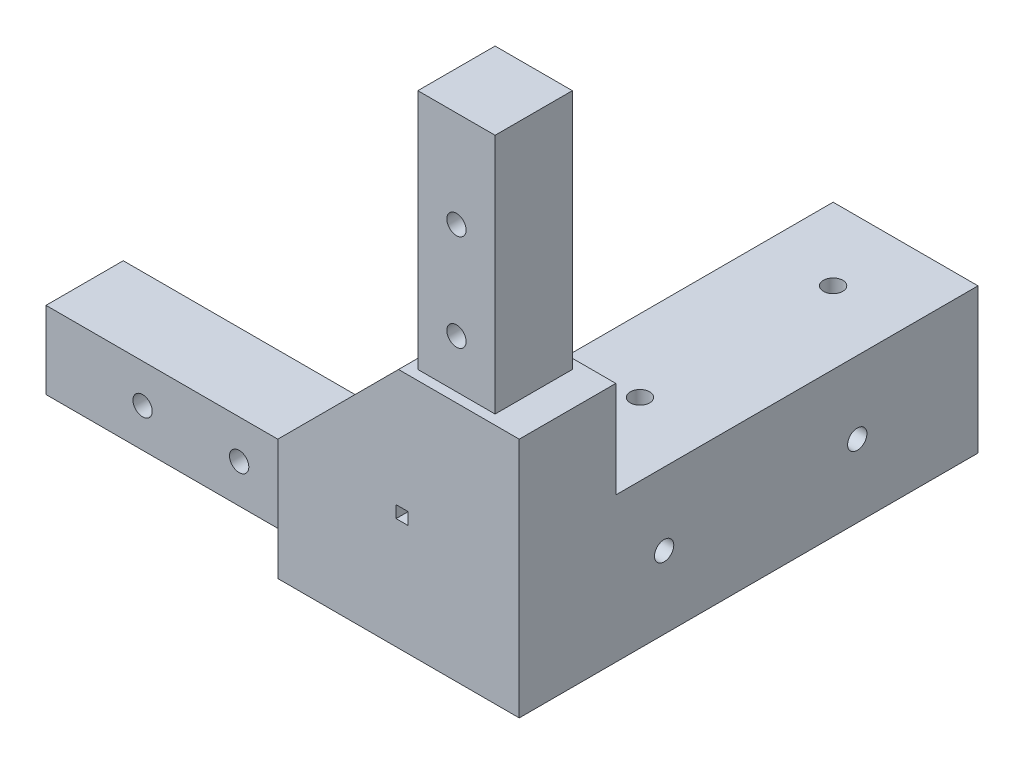
ISO-10303-21;
HEADER;
FILE_DESCRIPTION(('STEP AP214'),'2;1');
FILE_NAME('part.step','',(''),(''),'','','');
FILE_SCHEMA(('AUTOMOTIVE_DESIGN { 1 0 10303 214 1 1 1 1 }'));
ENDSEC;
DATA;
#1=APPLICATION_CONTEXT('core data for automotive mechanical design processes');
#2=APPLICATION_PROTOCOL_DEFINITION('international standard','automotive_design',2000,#1);
#3=PRODUCT_CONTEXT('',#1,'mechanical');
#4=PRODUCT('Part','Part','',(#3));
#5=PRODUCT_RELATED_PRODUCT_CATEGORY('part','',(#4));
#6=PRODUCT_DEFINITION_FORMATION('','',#4);
#7=PRODUCT_DEFINITION_CONTEXT('part definition',#1,'design');
#8=PRODUCT_DEFINITION('design','',#6,#7);
#9=PRODUCT_DEFINITION_SHAPE('','',#8);
#10=(LENGTH_UNIT() NAMED_UNIT(*) SI_UNIT(.MILLI.,.METRE.));
#11=(NAMED_UNIT(*) PLANE_ANGLE_UNIT() SI_UNIT($,.RADIAN.));
#12=(NAMED_UNIT(*) SI_UNIT($,.STERADIAN.) SOLID_ANGLE_UNIT());
#13=UNCERTAINTY_MEASURE_WITH_UNIT(LENGTH_MEASURE(1.E-05),#10,'distance_accuracy_value','');
#14=(GEOMETRIC_REPRESENTATION_CONTEXT(3) GLOBAL_UNCERTAINTY_ASSIGNED_CONTEXT((#13)) GLOBAL_UNIT_ASSIGNED_CONTEXT((#10,
#11,#12)) REPRESENTATION_CONTEXT('',''));
#15=CARTESIAN_POINT('',(0.,0.,0.));
#16=DIRECTION('',(0.,0.,1.));
#17=DIRECTION('',(1.,0.,0.));
#18=AXIS2_PLACEMENT_3D('',#15,#16,#17);
#19=CARTESIAN_POINT('',(50.,-50.,-100.));
#20=DIRECTION('',(1.,0.,0.));
#21=DIRECTION('',(0.,0.,-1.));
#22=AXIS2_PLACEMENT_3D('',#19,#20,#21);
#23=PLANE('',#22);
#24=DIRECTION('',(0.,0.,-1.));
#25=VECTOR('',#24,1.);
#26=CARTESIAN_POINT('',(50.,-20.,-30.));
#27=LINE('',#26,#25);
#28=CARTESIAN_POINT('',(50.,-20.,-25.));
#29=VERTEX_POINT('',#28);
#30=CARTESIAN_POINT('',(50.,-20.,-100.));
#31=VERTEX_POINT('',#30);
#32=EDGE_CURVE('E430',#29,#31,#27,.T.);
#33=ORIENTED_EDGE('',*,*,#32,.F.);
#34=DIRECTION('',(0.,1.,0.));
#35=VECTOR('',#34,1.);
#36=CARTESIAN_POINT('',(50.,-24.,-25.));
#37=LINE('',#36,#35);
#38=CARTESIAN_POINT('',(50.,0.,-25.));
#39=VERTEX_POINT('',#38);
#40=EDGE_CURVE('E218',#29,#39,#37,.T.);
#41=ORIENTED_EDGE('',*,*,#40,.T.);
#42=DIRECTION('',(0.,0.,-1.));
#43=VECTOR('',#42,1.);
#44=CARTESIAN_POINT('',(50.,0.,-5.));
#45=LINE('',#44,#43);
#46=CARTESIAN_POINT('',(50.,0.,-5.));
#47=VERTEX_POINT('',#46);
#48=EDGE_CURVE('E209',#47,#39,#45,.T.);
#49=ORIENTED_EDGE('',*,*,#48,.F.);
#50=DIRECTION('',(0.,1.,0.));
#51=VECTOR('',#50,1.);
#52=CARTESIAN_POINT('',(50.,-50.,-5.));
#53=LINE('',#52,#51);
#54=CARTESIAN_POINT('',(50.,-50.,-5.));
#55=VERTEX_POINT('',#54);
#56=EDGE_CURVE('E192',#55,#47,#53,.T.);
#57=ORIENTED_EDGE('',*,*,#56,.F.);
#58=DIRECTION('',(0.,0.,1.));
#59=VECTOR('',#58,1.);
#60=CARTESIAN_POINT('',(50.,-50.,-100.));
#61=LINE('',#60,#59);
#62=CARTESIAN_POINT('',(50.,-50.,-100.));
#63=VERTEX_POINT('',#62);
#64=EDGE_CURVE('E11',#63,#55,#61,.T.);
#65=ORIENTED_EDGE('',*,*,#64,.F.);
#66=DIRECTION('',(0.,1.,0.));
#67=VECTOR('',#66,1.);
#68=CARTESIAN_POINT('',(50.,-50.,-100.));
#69=LINE('',#68,#67);
#70=EDGE_CURVE('E42',#63,#31,#69,.T.);
#71=ORIENTED_EDGE('',*,*,#70,.T.);
#72=EDGE_LOOP('',(#33,#41,#49,#57,#65,#71));
#73=FACE_BOUND('',#72,.T.);
#74=CARTESIAN_POINT('',(50.,-35.,-35.));
#75=DIRECTION('',(1.,0.,0.));
#76=DIRECTION('',(0.,0.,-1.));
#77=AXIS2_PLACEMENT_3D('',#74,#75,#76);
#78=CIRCLE('',#77,2.);
#79=CARTESIAN_POINT('',(50.,-35.,-37.));
#80=VERTEX_POINT('',#79);
#81=EDGE_CURVE('E278',#80,#80,#78,.T.);
#82=ORIENTED_EDGE('',*,*,#81,.F.);
#83=EDGE_LOOP('',(#82));
#84=FACE_BOUND('',#83,.T.);
#85=CARTESIAN_POINT('',(50.,-35.,-75.));
#86=DIRECTION('',(1.,0.,0.));
#87=DIRECTION('',(0.,0.,-1.));
#88=AXIS2_PLACEMENT_3D('',#85,#86,#87);
#89=CIRCLE('',#88,2.);
#90=CARTESIAN_POINT('',(50.,-35.,-77.));
#91=VERTEX_POINT('',#90);
#92=EDGE_CURVE('E289',#91,#91,#89,.T.);
#93=ORIENTED_EDGE('',*,*,#92,.F.);
#94=EDGE_LOOP('',(#93));
#95=FACE_BOUND('',#94,.T.);
#96=ADVANCED_FACE('F33',(#73,#84,#95),#23,.T.);
#97=CARTESIAN_POINT('',(20.,-50.,-30.));
#98=DIRECTION('',(1.,0.,0.));
#99=DIRECTION('',(0.,0.,-1.));
#100=AXIS2_PLACEMENT_3D('',#97,#98,#99);
#101=PLANE('',#100);
#102=CARTESIAN_POINT('',(20.,-35.,-75.));
#103=DIRECTION('',(1.,0.,0.));
#104=DIRECTION('',(0.,0.,-1.));
#105=AXIS2_PLACEMENT_3D('',#102,#103,#104);
#106=CIRCLE('',#105,2.);
#107=CARTESIAN_POINT('',(20.,-35.,-77.));
#108=VERTEX_POINT('',#107);
#109=EDGE_CURVE('E290',#108,#108,#106,.T.);
#110=ORIENTED_EDGE('',*,*,#109,.T.);
#111=EDGE_LOOP('',(#110));
#112=FACE_BOUND('',#111,.T.);
#113=CARTESIAN_POINT('',(20.,-35.,-35.));
#114=DIRECTION('',(1.,0.,0.));
#115=DIRECTION('',(0.,0.,-1.));
#116=AXIS2_PLACEMENT_3D('',#113,#114,#115);
#117=CIRCLE('',#116,2.);
#118=CARTESIAN_POINT('',(20.,-35.,-37.));
#119=VERTEX_POINT('',#118);
#120=EDGE_CURVE('E281',#119,#119,#117,.T.);
#121=ORIENTED_EDGE('',*,*,#120,.T.);
#122=EDGE_LOOP('',(#121));
#123=FACE_BOUND('',#122,.T.);
#124=DIRECTION('',(0.,0.,-1.));
#125=VECTOR('',#124,1.);
#126=CARTESIAN_POINT('',(20.,-50.,-30.));
#127=LINE('',#126,#125);
#128=CARTESIAN_POINT('',(20.,-50.,-25.));
#129=VERTEX_POINT('',#128);
#130=CARTESIAN_POINT('',(20.,-50.,-100.));
#131=VERTEX_POINT('',#130);
#132=EDGE_CURVE('E431',#129,#131,#127,.T.);
#133=ORIENTED_EDGE('',*,*,#132,.F.);
#134=DIRECTION('',(0.,-1.,0.));
#135=VECTOR('',#134,1.);
#136=CARTESIAN_POINT('',(20.,-25.,-25.));
#137=LINE('',#136,#135);
#138=CARTESIAN_POINT('',(20.,-20.,-25.));
#139=VERTEX_POINT('',#138);
#140=EDGE_CURVE('E354',#139,#129,#137,.T.);
#141=ORIENTED_EDGE('',*,*,#140,.F.);
#142=DIRECTION('',(0.,0.,-1.));
#143=VECTOR('',#142,1.);
#144=CARTESIAN_POINT('',(20.,-20.,-30.));
#145=LINE('',#144,#143);
#146=CARTESIAN_POINT('',(20.,-20.,-100.));
#147=VERTEX_POINT('',#146);
#148=EDGE_CURVE('E434',#139,#147,#145,.T.);
#149=ORIENTED_EDGE('',*,*,#148,.T.);
#150=DIRECTION('',(0.,-1.,0.));
#151=VECTOR('',#150,1.);
#152=CARTESIAN_POINT('',(20.,-50.,-100.));
#153=LINE('',#152,#151);
#154=EDGE_CURVE('E427',#147,#131,#153,.T.);
#155=ORIENTED_EDGE('',*,*,#154,.T.);
#156=EDGE_LOOP('',(#133,#141,#149,#155));
#157=FACE_BOUND('',#156,.T.);
#158=ADVANCED_FACE('F466',(#112,#123,#157),#101,.F.);
#159=CARTESIAN_POINT('',(50.,-50.,-100.));
#160=DIRECTION('',(0.,-1.,0.));
#161=DIRECTION('',(1.,0.,0.));
#162=AXIS2_PLACEMENT_3D('',#159,#160,#161);
#163=PLANE('',#162);
#164=DIRECTION('',(1.,0.,0.));
#165=VECTOR('',#164,1.);
#166=CARTESIAN_POINT('',(20.,-50.,-5.));
#167=LINE('',#166,#165);
#168=CARTESIAN_POINT('',(0.,-50.,-4.99999999999999));
#169=VERTEX_POINT('',#168);
#170=EDGE_CURVE('E199',#169,#55,#167,.T.);
#171=ORIENTED_EDGE('',*,*,#170,.F.);
#172=DIRECTION('',(0.,0.,1.));
#173=VECTOR('',#172,1.);
#174=CARTESIAN_POINT('',(0.,-50.,-4.99999999999999));
#175=LINE('',#174,#173);
#176=CARTESIAN_POINT('',(0.,-50.,-25.));
#177=VERTEX_POINT('',#176);
#178=EDGE_CURVE('E238',#177,#169,#175,.T.);
#179=ORIENTED_EDGE('',*,*,#178,.F.);
#180=DIRECTION('',(-1.,0.,0.));
#181=VECTOR('',#180,1.);
#182=CARTESIAN_POINT('',(24.,-50.,-25.));
#183=LINE('',#182,#181);
#184=EDGE_CURVE('E245',#129,#177,#183,.T.);
#185=ORIENTED_EDGE('',*,*,#184,.F.);
#186=ORIENTED_EDGE('',*,*,#132,.T.);
#187=DIRECTION('',(1.,0.,0.));
#188=VECTOR('',#187,1.);
#189=CARTESIAN_POINT('',(50.,-50.,-100.));
#190=LINE('',#189,#188);
#191=EDGE_CURVE('E433',#131,#63,#190,.T.);
#192=ORIENTED_EDGE('',*,*,#191,.T.);
#193=ORIENTED_EDGE('',*,*,#64,.T.);
#194=EDGE_LOOP('',(#171,#179,#185,#186,#192,#193));
#195=FACE_BOUND('',#194,.T.);
#196=CARTESIAN_POINT('',(35.,-50.,-45.));
#197=DIRECTION('',(0.,1.,0.));
#198=DIRECTION('',(0.,0.,1.));
#199=AXIS2_PLACEMENT_3D('',#196,#197,#198);
#200=CIRCLE('',#199,2.);
#201=CARTESIAN_POINT('',(35.,-50.,-43.));
#202=VERTEX_POINT('',#201);
#203=EDGE_CURVE('E300',#202,#202,#200,.T.);
#204=ORIENTED_EDGE('',*,*,#203,.T.);
#205=EDGE_LOOP('',(#204));
#206=FACE_BOUND('',#205,.T.);
#207=CARTESIAN_POINT('',(35.,-50.,-85.));
#208=DIRECTION('',(0.,1.,0.));
#209=DIRECTION('',(0.,0.,1.));
#210=AXIS2_PLACEMENT_3D('',#207,#208,#209);
#211=CIRCLE('',#210,2.);
#212=CARTESIAN_POINT('',(35.,-50.,-83.));
#213=VERTEX_POINT('',#212);
#214=EDGE_CURVE('E310',#213,#213,#211,.T.);
#215=ORIENTED_EDGE('',*,*,#214,.T.);
#216=EDGE_LOOP('',(#215));
#217=FACE_BOUND('',#216,.T.);
#218=ADVANCED_FACE('F471',(#195,#206,#217),#163,.T.);
#219=CARTESIAN_POINT('',(20.,-20.,-30.));
#220=DIRECTION('',(0.,-1.,0.));
#221=DIRECTION('',(0.,0.,-1.));
#222=AXIS2_PLACEMENT_3D('',#219,#220,#221);
#223=PLANE('',#222);
#224=CARTESIAN_POINT('',(35.,-20.,-85.));
#225=DIRECTION('',(0.,1.,0.));
#226=DIRECTION('',(0.,0.,1.));
#227=AXIS2_PLACEMENT_3D('',#224,#225,#226);
#228=CIRCLE('',#227,2.);
#229=CARTESIAN_POINT('',(35.,-20.,-83.));
#230=VERTEX_POINT('',#229);
#231=EDGE_CURVE('E309',#230,#230,#228,.T.);
#232=ORIENTED_EDGE('',*,*,#231,.F.);
#233=EDGE_LOOP('',(#232));
#234=FACE_BOUND('',#233,.T.);
#235=CARTESIAN_POINT('',(35.,-20.,-45.));
#236=DIRECTION('',(0.,1.,0.));
#237=DIRECTION('',(0.,0.,1.));
#238=AXIS2_PLACEMENT_3D('',#235,#236,#237);
#239=CIRCLE('',#238,2.);
#240=CARTESIAN_POINT('',(35.,-20.,-43.));
#241=VERTEX_POINT('',#240);
#242=EDGE_CURVE('E299',#241,#241,#239,.T.);
#243=ORIENTED_EDGE('',*,*,#242,.F.);
#244=EDGE_LOOP('',(#243));
#245=FACE_BOUND('',#244,.T.);
#246=DIRECTION('',(-1.,0.,0.));
#247=VECTOR('',#246,1.);
#248=CARTESIAN_POINT('',(25.,-20.,-25.));
#249=LINE('',#248,#247);
#250=EDGE_CURVE('E351',#29,#139,#249,.T.);
#251=ORIENTED_EDGE('',*,*,#250,.F.);
#252=ORIENTED_EDGE('',*,*,#32,.T.);
#253=DIRECTION('',(-1.,0.,0.));
#254=VECTOR('',#253,1.);
#255=CARTESIAN_POINT('',(20.,-20.,-100.));
#256=LINE('',#255,#254);
#257=EDGE_CURVE('E419',#31,#147,#256,.T.);
#258=ORIENTED_EDGE('',*,*,#257,.T.);
#259=ORIENTED_EDGE('',*,*,#148,.F.);
#260=EDGE_LOOP('',(#251,#252,#258,#259));
#261=FACE_BOUND('',#260,.T.);
#262=ADVANCED_FACE('F478',(#234,#245,#261),#223,.F.);
#263=CARTESIAN_POINT('',(0.,0.,-100.));
#264=DIRECTION('',(0.,0.,1.));
#265=DIRECTION('',(1.,0.,0.));
#266=AXIS2_PLACEMENT_3D('',#263,#264,#265);
#267=PLANE('',#266);
#268=DIRECTION('',(-1.,0.,0.));
#269=VECTOR('',#268,1.);
#270=CARTESIAN_POINT('',(24.5,-45.5,-100.));
#271=LINE('',#270,#269);
#272=CARTESIAN_POINT('',(45.5,-45.5,-100.));
#273=VERTEX_POINT('',#272);
#274=CARTESIAN_POINT('',(24.5,-45.5,-100.));
#275=VERTEX_POINT('',#274);
#276=EDGE_CURVE('E410',#273,#275,#271,.T.);
#277=ORIENTED_EDGE('',*,*,#276,.F.);
#278=DIRECTION('',(0.,-1.,0.));
#279=VECTOR('',#278,1.);
#280=CARTESIAN_POINT('',(45.5,-45.5,-100.));
#281=LINE('',#280,#279);
#282=CARTESIAN_POINT('',(45.5,-24.5,-100.));
#283=VERTEX_POINT('',#282);
#284=EDGE_CURVE('E389',#283,#273,#281,.T.);
#285=ORIENTED_EDGE('',*,*,#284,.F.);
#286=DIRECTION('',(1.,0.,0.));
#287=VECTOR('',#286,1.);
#288=CARTESIAN_POINT('',(24.5,-24.5,-100.));
#289=LINE('',#288,#287);
#290=CARTESIAN_POINT('',(24.5,-24.5,-100.));
#291=VERTEX_POINT('',#290);
#292=EDGE_CURVE('E400',#291,#283,#289,.T.);
#293=ORIENTED_EDGE('',*,*,#292,.F.);
#294=DIRECTION('',(0.,1.,0.));
#295=VECTOR('',#294,1.);
#296=CARTESIAN_POINT('',(24.5,-45.5,-100.));
#297=LINE('',#296,#295);
#298=EDGE_CURVE('E413',#275,#291,#297,.T.);
#299=ORIENTED_EDGE('',*,*,#298,.F.);
#300=EDGE_LOOP('',(#277,#285,#293,#299));
#301=FACE_BOUND('',#300,.T.);
#302=ORIENTED_EDGE('',*,*,#191,.F.);
#303=ORIENTED_EDGE('',*,*,#154,.F.);
#304=ORIENTED_EDGE('',*,*,#257,.F.);
#305=ORIENTED_EDGE('',*,*,#70,.F.);
#306=EDGE_LOOP('',(#302,#303,#304,#305));
#307=FACE_BOUND('',#306,.T.);
#308=ADVANCED_FACE('F483',(#301,#307),#267,.F.);
#309=CARTESIAN_POINT('',(45.5,-45.5,-10.));
#310=DIRECTION('',(1.,0.,0.));
#311=DIRECTION('',(0.,0.,-1.));
#312=AXIS2_PLACEMENT_3D('',#309,#310,#311);
#313=PLANE('',#312);
#314=CARTESIAN_POINT('',(45.5,-35.,-35.));
#315=DIRECTION('',(1.,0.,0.));
#316=DIRECTION('',(0.,0.,-1.));
#317=AXIS2_PLACEMENT_3D('',#314,#315,#316);
#318=CIRCLE('',#317,2.);
#319=CARTESIAN_POINT('',(45.5,-35.,-37.));
#320=VERTEX_POINT('',#319);
#321=EDGE_CURVE('E286',#320,#320,#318,.T.);
#322=ORIENTED_EDGE('',*,*,#321,.T.);
#323=EDGE_LOOP('',(#322));
#324=FACE_BOUND('',#323,.T.);
#325=CARTESIAN_POINT('',(45.5,-35.,-75.));
#326=DIRECTION('',(1.,0.,0.));
#327=DIRECTION('',(0.,0.,-1.));
#328=AXIS2_PLACEMENT_3D('',#325,#326,#327);
#329=CIRCLE('',#328,2.);
#330=CARTESIAN_POINT('',(45.5,-35.,-77.));
#331=VERTEX_POINT('',#330);
#332=EDGE_CURVE('E296',#331,#331,#329,.T.);
#333=ORIENTED_EDGE('',*,*,#332,.T.);
#334=EDGE_LOOP('',(#333));
#335=FACE_BOUND('',#334,.T.);
#336=ORIENTED_EDGE('',*,*,#284,.T.);
#337=DIRECTION('',(0.,0.,-1.));
#338=VECTOR('',#337,1.);
#339=CARTESIAN_POINT('',(45.5,-45.5,-10.));
#340=LINE('',#339,#338);
#341=CARTESIAN_POINT('',(45.5,-45.5,-10.));
#342=VERTEX_POINT('',#341);
#343=EDGE_CURVE('E408',#342,#273,#340,.T.);
#344=ORIENTED_EDGE('',*,*,#343,.F.);
#345=DIRECTION('',(0.,-1.,0.));
#346=VECTOR('',#345,1.);
#347=CARTESIAN_POINT('',(45.5,-45.5,-10.));
#348=LINE('',#347,#346);
#349=CARTESIAN_POINT('',(45.5,-24.5,-10.));
#350=VERTEX_POINT('',#349);
#351=EDGE_CURVE('E396',#350,#342,#348,.T.);
#352=ORIENTED_EDGE('',*,*,#351,.F.);
#353=DIRECTION('',(0.,0.,-1.));
#354=VECTOR('',#353,1.);
#355=CARTESIAN_POINT('',(45.5,-24.5,-10.));
#356=LINE('',#355,#354);
#357=EDGE_CURVE('E417',#350,#283,#356,.T.);
#358=ORIENTED_EDGE('',*,*,#357,.T.);
#359=EDGE_LOOP('',(#336,#344,#352,#358));
#360=FACE_BOUND('',#359,.T.);
#361=ADVANCED_FACE('F521',(#324,#335,#360),#313,.F.);
#362=CARTESIAN_POINT('',(24.5,-24.5,-10.));
#363=DIRECTION('',(0.,1.,0.));
#364=DIRECTION('',(0.,0.,1.));
#365=AXIS2_PLACEMENT_3D('',#362,#363,#364);
#366=PLANE('',#365);
#367=CARTESIAN_POINT('',(35.,-24.5,-45.));
#368=DIRECTION('',(0.,1.,0.));
#369=DIRECTION('',(0.,0.,1.));
#370=AXIS2_PLACEMENT_3D('',#367,#368,#369);
#371=CIRCLE('',#370,2.);
#372=CARTESIAN_POINT('',(35.,-24.5,-43.));
#373=VERTEX_POINT('',#372);
#374=EDGE_CURVE('E306',#373,#373,#371,.T.);
#375=ORIENTED_EDGE('',*,*,#374,.T.);
#376=EDGE_LOOP('',(#375));
#377=FACE_BOUND('',#376,.T.);
#378=CARTESIAN_POINT('',(35.,-24.5,-85.));
#379=DIRECTION('',(0.,1.,0.));
#380=DIRECTION('',(0.,0.,1.));
#381=AXIS2_PLACEMENT_3D('',#378,#379,#380);
#382=CIRCLE('',#381,2.);
#383=CARTESIAN_POINT('',(35.,-24.5,-83.));
#384=VERTEX_POINT('',#383);
#385=EDGE_CURVE('E316',#384,#384,#382,.T.);
#386=ORIENTED_EDGE('',*,*,#385,.T.);
#387=EDGE_LOOP('',(#386));
#388=FACE_BOUND('',#387,.T.);
#389=DIRECTION('',(1.,0.,0.));
#390=VECTOR('',#389,1.);
#391=CARTESIAN_POINT('',(24.5,-24.5,-10.));
#392=LINE('',#391,#390);
#393=CARTESIAN_POINT('',(27.,-24.5,-10.));
#394=VERTEX_POINT('',#393);
#395=EDGE_CURVE('E406',#394,#350,#392,.T.);
#396=ORIENTED_EDGE('',*,*,#395,.F.);
#397=DIRECTION('',(0.,0.,-1.));
#398=VECTOR('',#397,1.);
#399=CARTESIAN_POINT('',(27.,-24.5,-4.99999999999999));
#400=LINE('',#399,#398);
#401=CARTESIAN_POINT('',(27.,-24.5,-4.99999999999999));
#402=VERTEX_POINT('',#401);
#403=EDGE_CURVE('E239',#402,#394,#400,.T.);
#404=ORIENTED_EDGE('',*,*,#403,.F.);
#405=DIRECTION('',(1.,0.,0.));
#406=VECTOR('',#405,1.);
#407=CARTESIAN_POINT('',(27.,-24.5,-4.99999999999999));
#408=LINE('',#407,#406);
#409=CARTESIAN_POINT('',(24.5,-24.5,-4.99999999999999));
#410=VERTEX_POINT('',#409);
#411=EDGE_CURVE('E228',#410,#402,#408,.T.);
#412=ORIENTED_EDGE('',*,*,#411,.F.);
#413=DIRECTION('',(0.,0.,-1.));
#414=VECTOR('',#413,1.);
#415=CARTESIAN_POINT('',(24.5,-24.5,-10.));
#416=LINE('',#415,#414);
#417=EDGE_CURVE('E50',#410,#291,#416,.T.);
#418=ORIENTED_EDGE('',*,*,#417,.T.);
#419=ORIENTED_EDGE('',*,*,#292,.T.);
#420=ORIENTED_EDGE('',*,*,#357,.F.);
#421=EDGE_LOOP('',(#396,#404,#412,#418,#419,#420));
#422=FACE_BOUND('',#421,.T.);
#423=ADVANCED_FACE('F523',(#377,#388,#422),#366,.F.);
#424=CARTESIAN_POINT('',(24.5,-45.5,-10.));
#425=DIRECTION('',(-1.,0.,0.));
#426=DIRECTION('',(0.,0.,1.));
#427=AXIS2_PLACEMENT_3D('',#424,#425,#426);
#428=PLANE('',#427);
#429=DIRECTION('',(0.,0.,-1.));
#430=VECTOR('',#429,1.);
#431=CARTESIAN_POINT('',(24.5,-27.,-4.99999999999999));
#432=LINE('',#431,#430);
#433=CARTESIAN_POINT('',(24.5,-27.,-4.99999999999999));
#434=VERTEX_POINT('',#433);
#435=CARTESIAN_POINT('',(24.5,-27.,-10.));
#436=VERTEX_POINT('',#435);
#437=EDGE_CURVE('E234',#434,#436,#432,.T.);
#438=ORIENTED_EDGE('',*,*,#437,.T.);
#439=DIRECTION('',(0.,1.,0.));
#440=VECTOR('',#439,1.);
#441=CARTESIAN_POINT('',(24.5,-45.5,-10.));
#442=LINE('',#441,#440);
#443=CARTESIAN_POINT('',(24.5,-45.5,-10.));
#444=VERTEX_POINT('',#443);
#445=EDGE_CURVE('E403',#444,#436,#442,.T.);
#446=ORIENTED_EDGE('',*,*,#445,.F.);
#447=DIRECTION('',(0.,0.,-1.));
#448=VECTOR('',#447,1.);
#449=CARTESIAN_POINT('',(24.5,-45.5,-10.));
#450=LINE('',#449,#448);
#451=EDGE_CURVE('E421',#444,#275,#450,.T.);
#452=ORIENTED_EDGE('',*,*,#451,.T.);
#453=ORIENTED_EDGE('',*,*,#298,.T.);
#454=ORIENTED_EDGE('',*,*,#417,.F.);
#455=DIRECTION('',(0.,1.,0.));
#456=VECTOR('',#455,1.);
#457=CARTESIAN_POINT('',(24.5,-24.5,-4.99999999999999));
#458=LINE('',#457,#456);
#459=EDGE_CURVE('E225',#434,#410,#458,.T.);
#460=ORIENTED_EDGE('',*,*,#459,.F.);
#461=EDGE_LOOP('',(#438,#446,#452,#453,#454,#460));
#462=FACE_BOUND('',#461,.T.);
#463=CARTESIAN_POINT('',(24.5,-35.,-35.));
#464=DIRECTION('',(-1.,0.,0.));
#465=DIRECTION('',(0.,0.,1.));
#466=AXIS2_PLACEMENT_3D('',#463,#464,#465);
#467=CIRCLE('',#466,2.);
#468=CARTESIAN_POINT('',(24.5,-35.,-33.));
#469=VERTEX_POINT('',#468);
#470=EDGE_CURVE('E37',#469,#469,#467,.T.);
#471=ORIENTED_EDGE('',*,*,#470,.T.);
#472=EDGE_LOOP('',(#471));
#473=FACE_BOUND('',#472,.T.);
#474=CARTESIAN_POINT('',(24.5,-35.,-75.));
#475=DIRECTION('',(-1.,0.,0.));
#476=DIRECTION('',(0.,0.,1.));
#477=AXIS2_PLACEMENT_3D('',#474,#475,#476);
#478=CIRCLE('',#477,2.);
#479=CARTESIAN_POINT('',(24.5,-35.,-73.));
#480=VERTEX_POINT('',#479);
#481=EDGE_CURVE('E293',#480,#480,#478,.T.);
#482=ORIENTED_EDGE('',*,*,#481,.T.);
#483=EDGE_LOOP('',(#482));
#484=FACE_BOUND('',#483,.T.);
#485=ADVANCED_FACE('F446',(#462,#473,#484),#428,.F.);
#486=CARTESIAN_POINT('',(24.5,-45.5,-10.));
#487=DIRECTION('',(0.,-1.,0.));
#488=DIRECTION('',(0.,0.,-1.));
#489=AXIS2_PLACEMENT_3D('',#486,#487,#488);
#490=PLANE('',#489);
#491=CARTESIAN_POINT('',(35.,-45.5,-45.));
#492=DIRECTION('',(0.,-1.,0.));
#493=DIRECTION('',(0.,0.,-1.));
#494=AXIS2_PLACEMENT_3D('',#491,#492,#493);
#495=CIRCLE('',#494,2.);
#496=CARTESIAN_POINT('',(35.,-45.5,-47.));
#497=VERTEX_POINT('',#496);
#498=EDGE_CURVE('E303',#497,#497,#495,.T.);
#499=ORIENTED_EDGE('',*,*,#498,.T.);
#500=EDGE_LOOP('',(#499));
#501=FACE_BOUND('',#500,.T.);
#502=CARTESIAN_POINT('',(35.,-45.5,-85.));
#503=DIRECTION('',(0.,-1.,0.));
#504=DIRECTION('',(0.,0.,-1.));
#505=AXIS2_PLACEMENT_3D('',#502,#503,#504);
#506=CIRCLE('',#505,2.);
#507=CARTESIAN_POINT('',(35.,-45.5,-87.));
#508=VERTEX_POINT('',#507);
#509=EDGE_CURVE('E313',#508,#508,#506,.T.);
#510=ORIENTED_EDGE('',*,*,#509,.T.);
#511=EDGE_LOOP('',(#510));
#512=FACE_BOUND('',#511,.T.);
#513=ORIENTED_EDGE('',*,*,#276,.T.);
#514=ORIENTED_EDGE('',*,*,#451,.F.);
#515=DIRECTION('',(-1.,0.,0.));
#516=VECTOR('',#515,1.);
#517=CARTESIAN_POINT('',(24.5,-45.5,-10.));
#518=LINE('',#517,#516);
#519=EDGE_CURVE('E399',#342,#444,#518,.T.);
#520=ORIENTED_EDGE('',*,*,#519,.F.);
#521=ORIENTED_EDGE('',*,*,#343,.T.);
#522=EDGE_LOOP('',(#513,#514,#520,#521));
#523=FACE_BOUND('',#522,.T.);
#524=ADVANCED_FACE('F499',(#501,#512,#523),#490,.F.);
#525=CARTESIAN_POINT('',(0.,0.,-10.));
#526=DIRECTION('',(0.,0.,-1.));
#527=DIRECTION('',(-1.,0.,0.));
#528=AXIS2_PLACEMENT_3D('',#525,#526,#527);
#529=PLANE('',#528);
#530=DIRECTION('',(0.,-1.,0.));
#531=VECTOR('',#530,1.);
#532=CARTESIAN_POINT('',(27.,0.,-10.));
#533=LINE('',#532,#531);
#534=CARTESIAN_POINT('',(27.,-27.,-10.));
#535=VERTEX_POINT('',#534);
#536=EDGE_CURVE('E251',#394,#535,#533,.T.);
#537=ORIENTED_EDGE('',*,*,#536,.F.);
#538=ORIENTED_EDGE('',*,*,#395,.T.);
#539=ORIENTED_EDGE('',*,*,#351,.T.);
#540=ORIENTED_EDGE('',*,*,#519,.T.);
#541=ORIENTED_EDGE('',*,*,#445,.T.);
#542=DIRECTION('',(-1.,0.,0.));
#543=VECTOR('',#542,1.);
#544=CARTESIAN_POINT('',(0.,-27.,-10.));
#545=LINE('',#544,#543);
#546=EDGE_CURVE('E254',#535,#436,#545,.T.);
#547=ORIENTED_EDGE('',*,*,#546,.F.);
#548=EDGE_LOOP('',(#537,#538,#539,#540,#541,#547));
#549=FACE_BOUND('',#548,.T.);
#550=ADVANCED_FACE('F502',(#549),#529,.T.);
#551=CARTESIAN_POINT('',(20.,-25.,-4.99999999999999));
#552=DIRECTION('',(0.,0.,1.));
#553=DIRECTION('',(1.,0.,0.));
#554=AXIS2_PLACEMENT_3D('',#551,#552,#553);
#555=PLANE('',#554);
#556=ORIENTED_EDGE('',*,*,#56,.T.);
#557=DIRECTION('',(1.,0.,0.));
#558=VECTOR('',#557,1.);
#559=CARTESIAN_POINT('',(25.,0.,-5.));
#560=LINE('',#559,#558);
#561=CARTESIAN_POINT('',(25.,0.,-5.));
#562=VERTEX_POINT('',#561);
#563=EDGE_CURVE('E197',#562,#47,#560,.T.);
#564=ORIENTED_EDGE('',*,*,#563,.F.);
#565=DIRECTION('',(-0.707106781186547,-0.707106781186548,0.));
#566=VECTOR('',#565,1.);
#567=CARTESIAN_POINT('',(25.,0.,-4.99999999999999));
#568=LINE('',#567,#566);
#569=CARTESIAN_POINT('',(0.,-25.,-4.99999999999999));
#570=VERTEX_POINT('',#569);
#571=EDGE_CURVE('E248',#562,#570,#568,.T.);
#572=ORIENTED_EDGE('',*,*,#571,.T.);
#573=DIRECTION('',(0.,1.,0.));
#574=VECTOR('',#573,1.);
#575=CARTESIAN_POINT('',(0.,-25.,-4.99999999999999));
#576=LINE('',#575,#574);
#577=EDGE_CURVE('E353',#169,#570,#576,.T.);
#578=ORIENTED_EDGE('',*,*,#577,.F.);
#579=ORIENTED_EDGE('',*,*,#170,.T.);
#580=EDGE_LOOP('',(#556,#564,#572,#578,#579));
#581=FACE_BOUND('',#580,.T.);
#582=DIRECTION('',(-1.,0.,0.));
#583=VECTOR('',#582,1.);
#584=CARTESIAN_POINT('',(27.,-27.,-4.99999999999999));
#585=LINE('',#584,#583);
#586=CARTESIAN_POINT('',(27.,-27.,-4.99999999999999));
#587=VERTEX_POINT('',#586);
#588=EDGE_CURVE('E220',#587,#434,#585,.T.);
#589=ORIENTED_EDGE('',*,*,#588,.T.);
#590=ORIENTED_EDGE('',*,*,#459,.T.);
#591=ORIENTED_EDGE('',*,*,#411,.T.);
#592=DIRECTION('',(0.,-1.,0.));
#593=VECTOR('',#592,1.);
#594=CARTESIAN_POINT('',(27.,-24.5,-4.99999999999999));
#595=LINE('',#594,#593);
#596=EDGE_CURVE('E231',#402,#587,#595,.T.);
#597=ORIENTED_EDGE('',*,*,#596,.T.);
#598=EDGE_LOOP('',(#589,#590,#591,#597));
#599=FACE_BOUND('',#598,.T.);
#600=ADVANCED_FACE('F194',(#581,#599),#555,.T.);
#601=CARTESIAN_POINT('',(20.,-25.,-25.));
#602=DIRECTION('',(0.,0.,-1.));
#603=DIRECTION('',(-1.,0.,0.));
#604=AXIS2_PLACEMENT_3D('',#601,#602,#603);
#605=PLANE('',#604);
#606=DIRECTION('',(-0.707106781186547,-0.707106781186548,0.));
#607=VECTOR('',#606,1.);
#608=CARTESIAN_POINT('',(25.,0.,-25.));
#609=LINE('',#608,#607);
#610=CARTESIAN_POINT('',(25.,0.,-25.));
#611=VERTEX_POINT('',#610);
#612=CARTESIAN_POINT('',(0.,-25.,-25.));
#613=VERTEX_POINT('',#612);
#614=EDGE_CURVE('E249',#611,#613,#609,.T.);
#615=ORIENTED_EDGE('',*,*,#614,.F.);
#616=DIRECTION('',(-1.,0.,0.));
#617=VECTOR('',#616,1.);
#618=CARTESIAN_POINT('',(25.,0.,-25.));
#619=LINE('',#618,#617);
#620=EDGE_CURVE('E212',#39,#611,#619,.T.);
#621=ORIENTED_EDGE('',*,*,#620,.F.);
#622=ORIENTED_EDGE('',*,*,#40,.F.);
#623=ORIENTED_EDGE('',*,*,#250,.T.);
#624=ORIENTED_EDGE('',*,*,#140,.T.);
#625=ORIENTED_EDGE('',*,*,#184,.T.);
#626=DIRECTION('',(0.,-1.,0.));
#627=VECTOR('',#626,1.);
#628=CARTESIAN_POINT('',(0.,-25.,-25.));
#629=LINE('',#628,#627);
#630=EDGE_CURVE('E357',#613,#177,#629,.T.);
#631=ORIENTED_EDGE('',*,*,#630,.F.);
#632=EDGE_LOOP('',(#615,#621,#622,#623,#624,#625,#631));
#633=FACE_BOUND('',#632,.T.);
#634=ADVANCED_FACE('F605',(#633),#605,.T.);
#635=CARTESIAN_POINT('',(-50.,-50.,-100.));
#636=DIRECTION('',(-1.,0.,0.));
#637=DIRECTION('',(0.,0.,1.));
#638=AXIS2_PLACEMENT_3D('',#635,#636,#637);
#639=PLANE('',#638);
#640=DIRECTION('',(0.,0.,1.));
#641=VECTOR('',#640,1.);
#642=CARTESIAN_POINT('',(-50.,-43.,-23.));
#643=LINE('',#642,#641);
#644=CARTESIAN_POINT('',(-50.,-43.,-23.));
#645=VERTEX_POINT('',#644);
#646=CARTESIAN_POINT('',(-50.,-43.,-7.));
#647=VERTEX_POINT('',#646);
#648=EDGE_CURVE('E367',#645,#647,#643,.T.);
#649=ORIENTED_EDGE('',*,*,#648,.T.);
#650=DIRECTION('',(0.,1.,0.));
#651=VECTOR('',#650,1.);
#652=CARTESIAN_POINT('',(-50.,-27.,-7.));
#653=LINE('',#652,#651);
#654=CARTESIAN_POINT('',(-50.,-27.,-7.));
#655=VERTEX_POINT('',#654);
#656=EDGE_CURVE('E356',#647,#655,#653,.T.);
#657=ORIENTED_EDGE('',*,*,#656,.T.);
#658=DIRECTION('',(0.,0.,-1.));
#659=VECTOR('',#658,1.);
#660=CARTESIAN_POINT('',(-50.,-27.,-23.));
#661=LINE('',#660,#659);
#662=CARTESIAN_POINT('',(-50.,-27.,-23.));
#663=VERTEX_POINT('',#662);
#664=EDGE_CURVE('E379',#655,#663,#661,.T.);
#665=ORIENTED_EDGE('',*,*,#664,.T.);
#666=DIRECTION('',(0.,-1.,0.));
#667=VECTOR('',#666,1.);
#668=CARTESIAN_POINT('',(-50.,-27.,-23.));
#669=LINE('',#668,#667);
#670=EDGE_CURVE('E382',#663,#645,#669,.T.);
#671=ORIENTED_EDGE('',*,*,#670,.T.);
#672=EDGE_LOOP('',(#649,#657,#665,#671));
#673=FACE_BOUND('',#672,.T.);
#674=ADVANCED_FACE('F35',(#673),#639,.T.);
#675=CARTESIAN_POINT('',(0.,-27.,-7.));
#676=DIRECTION('',(0.,0.,1.));
#677=DIRECTION('',(0.,-1.,0.));
#678=AXIS2_PLACEMENT_3D('',#675,#676,#677);
#679=PLANE('',#678);
#680=CARTESIAN_POINT('',(-10.,-35.,-7.));
#681=DIRECTION('',(0.,0.,-1.));
#682=DIRECTION('',(-1.,0.,0.));
#683=AXIS2_PLACEMENT_3D('',#680,#681,#682);
#684=CIRCLE('',#683,2.);
#685=CARTESIAN_POINT('',(-12.,-35.,-7.));
#686=VERTEX_POINT('',#685);
#687=EDGE_CURVE('E257',#686,#686,#684,.T.);
#688=ORIENTED_EDGE('',*,*,#687,.T.);
#689=EDGE_LOOP('',(#688));
#690=FACE_BOUND('',#689,.T.);
#691=CARTESIAN_POINT('',(-30.,-35.,-7.));
#692=DIRECTION('',(0.,0.,-1.));
#693=DIRECTION('',(-1.,0.,0.));
#694=AXIS2_PLACEMENT_3D('',#691,#692,#693);
#695=CIRCLE('',#694,2.);
#696=CARTESIAN_POINT('',(-32.,-35.,-7.));
#697=VERTEX_POINT('',#696);
#698=EDGE_CURVE('E263',#697,#697,#695,.T.);
#699=ORIENTED_EDGE('',*,*,#698,.T.);
#700=EDGE_LOOP('',(#699));
#701=FACE_BOUND('',#700,.T.);
#702=ORIENTED_EDGE('',*,*,#656,.F.);
#703=DIRECTION('',(-1.,0.,0.));
#704=VECTOR('',#703,1.);
#705=CARTESIAN_POINT('',(0.,-43.,-7.));
#706=LINE('',#705,#704);
#707=CARTESIAN_POINT('',(0.,-43.,-7.));
#708=VERTEX_POINT('',#707);
#709=EDGE_CURVE('E387',#708,#647,#706,.T.);
#710=ORIENTED_EDGE('',*,*,#709,.F.);
#711=DIRECTION('',(0.,1.,0.));
#712=VECTOR('',#711,1.);
#713=CARTESIAN_POINT('',(0.,-27.,-7.));
#714=LINE('',#713,#712);
#715=CARTESIAN_POINT('',(0.,-27.,-7.));
#716=VERTEX_POINT('',#715);
#717=EDGE_CURVE('E363',#708,#716,#714,.T.);
#718=ORIENTED_EDGE('',*,*,#717,.T.);
#719=DIRECTION('',(-1.,0.,0.));
#720=VECTOR('',#719,1.);
#721=CARTESIAN_POINT('',(0.,-27.,-7.));
#722=LINE('',#721,#720);
#723=EDGE_CURVE('E376',#716,#655,#722,.T.);
#724=ORIENTED_EDGE('',*,*,#723,.T.);
#725=EDGE_LOOP('',(#702,#710,#718,#724));
#726=FACE_BOUND('',#725,.T.);
#727=ADVANCED_FACE('F588',(#690,#701,#726),#679,.T.);
#728=CARTESIAN_POINT('',(0.,-27.,-23.));
#729=DIRECTION('',(0.,1.,0.));
#730=DIRECTION('',(0.,0.,1.));
#731=AXIS2_PLACEMENT_3D('',#728,#729,#730);
#732=PLANE('',#731);
#733=ORIENTED_EDGE('',*,*,#664,.F.);
#734=ORIENTED_EDGE('',*,*,#723,.F.);
#735=DIRECTION('',(0.,0.,-1.));
#736=VECTOR('',#735,1.);
#737=CARTESIAN_POINT('',(0.,-27.,-23.));
#738=LINE('',#737,#736);
#739=CARTESIAN_POINT('',(0.,-27.,-23.));
#740=VERTEX_POINT('',#739);
#741=EDGE_CURVE('E366',#716,#740,#738,.T.);
#742=ORIENTED_EDGE('',*,*,#741,.T.);
#743=DIRECTION('',(-1.,0.,0.));
#744=VECTOR('',#743,1.);
#745=CARTESIAN_POINT('',(0.,-27.,-23.));
#746=LINE('',#745,#744);
#747=EDGE_CURVE('E392',#740,#663,#746,.T.);
#748=ORIENTED_EDGE('',*,*,#747,.T.);
#749=EDGE_LOOP('',(#733,#734,#742,#748));
#750=FACE_BOUND('',#749,.T.);
#751=ADVANCED_FACE('F591',(#750),#732,.T.);
#752=CARTESIAN_POINT('',(0.,-27.,-23.));
#753=DIRECTION('',(0.,0.,-1.));
#754=DIRECTION('',(-1.,0.,0.));
#755=AXIS2_PLACEMENT_3D('',#752,#753,#754);
#756=PLANE('',#755);
#757=CARTESIAN_POINT('',(-10.,-35.,-23.));
#758=DIRECTION('',(0.,0.,-1.));
#759=DIRECTION('',(-1.,0.,0.));
#760=AXIS2_PLACEMENT_3D('',#757,#758,#759);
#761=CIRCLE('',#760,2.);
#762=CARTESIAN_POINT('',(-12.,-35.,-23.));
#763=VERTEX_POINT('',#762);
#764=EDGE_CURVE('E203',#763,#763,#761,.T.);
#765=ORIENTED_EDGE('',*,*,#764,.F.);
#766=EDGE_LOOP('',(#765));
#767=FACE_BOUND('',#766,.T.);
#768=CARTESIAN_POINT('',(-30.,-35.,-23.));
#769=DIRECTION('',(0.,0.,-1.));
#770=DIRECTION('',(-1.,0.,0.));
#771=AXIS2_PLACEMENT_3D('',#768,#769,#770);
#772=CIRCLE('',#771,2.);
#773=CARTESIAN_POINT('',(-32.,-35.,-23.));
#774=VERTEX_POINT('',#773);
#775=EDGE_CURVE('E260',#774,#774,#772,.T.);
#776=ORIENTED_EDGE('',*,*,#775,.F.);
#777=EDGE_LOOP('',(#776));
#778=FACE_BOUND('',#777,.T.);
#779=ORIENTED_EDGE('',*,*,#670,.F.);
#780=ORIENTED_EDGE('',*,*,#747,.F.);
#781=DIRECTION('',(0.,-1.,0.));
#782=VECTOR('',#781,1.);
#783=CARTESIAN_POINT('',(0.,-27.,-23.));
#784=LINE('',#783,#782);
#785=CARTESIAN_POINT('',(0.,-43.,-23.));
#786=VERTEX_POINT('',#785);
#787=EDGE_CURVE('E370',#740,#786,#784,.T.);
#788=ORIENTED_EDGE('',*,*,#787,.T.);
#789=DIRECTION('',(-1.,0.,0.));
#790=VECTOR('',#789,1.);
#791=CARTESIAN_POINT('',(0.,-43.,-23.));
#792=LINE('',#791,#790);
#793=EDGE_CURVE('E390',#786,#645,#792,.T.);
#794=ORIENTED_EDGE('',*,*,#793,.T.);
#795=EDGE_LOOP('',(#779,#780,#788,#794));
#796=FACE_BOUND('',#795,.T.);
#797=ADVANCED_FACE('F595',(#767,#778,#796),#756,.T.);
#798=CARTESIAN_POINT('',(0.,-43.,-23.));
#799=DIRECTION('',(0.,-1.,0.));
#800=DIRECTION('',(0.,0.,-1.));
#801=AXIS2_PLACEMENT_3D('',#798,#799,#800);
#802=PLANE('',#801);
#803=ORIENTED_EDGE('',*,*,#648,.F.);
#804=ORIENTED_EDGE('',*,*,#793,.F.);
#805=DIRECTION('',(0.,0.,1.));
#806=VECTOR('',#805,1.);
#807=CARTESIAN_POINT('',(0.,-43.,-23.));
#808=LINE('',#807,#806);
#809=EDGE_CURVE('E373',#786,#708,#808,.T.);
#810=ORIENTED_EDGE('',*,*,#809,.T.);
#811=ORIENTED_EDGE('',*,*,#709,.T.);
#812=EDGE_LOOP('',(#803,#804,#810,#811));
#813=FACE_BOUND('',#812,.T.);
#814=ADVANCED_FACE('F586',(#813),#802,.T.);
#815=CARTESIAN_POINT('',(0.,0.,0.));
#816=DIRECTION('',(-1.,0.,0.));
#817=DIRECTION('',(0.,0.,1.));
#818=AXIS2_PLACEMENT_3D('',#815,#816,#817);
#819=PLANE('',#818);
#820=ORIENTED_EDGE('',*,*,#717,.F.);
#821=ORIENTED_EDGE('',*,*,#809,.F.);
#822=ORIENTED_EDGE('',*,*,#787,.F.);
#823=ORIENTED_EDGE('',*,*,#741,.F.);
#824=EDGE_LOOP('',(#820,#821,#822,#823));
#825=FACE_BOUND('',#824,.T.);
#826=ORIENTED_EDGE('',*,*,#577,.T.);
#827=DIRECTION('',(0.,0.,-1.));
#828=VECTOR('',#827,1.);
#829=CARTESIAN_POINT('',(0.,-25.,-25.));
#830=LINE('',#829,#828);
#831=EDGE_CURVE('E359',#570,#613,#830,.T.);
#832=ORIENTED_EDGE('',*,*,#831,.T.);
#833=ORIENTED_EDGE('',*,*,#630,.T.);
#834=ORIENTED_EDGE('',*,*,#178,.T.);
#835=EDGE_LOOP('',(#826,#832,#833,#834));
#836=FACE_BOUND('',#835,.T.);
#837=ADVANCED_FACE('F583',(#825,#836),#819,.T.);
#838=CARTESIAN_POINT('',(0.,0.,0.));
#839=DIRECTION('',(0.,1.,0.));
#840=DIRECTION('',(0.,0.,1.));
#841=AXIS2_PLACEMENT_3D('',#838,#839,#840);
#842=PLANE('',#841);
#843=DIRECTION('',(-1.,0.,0.));
#844=VECTOR('',#843,1.);
#845=CARTESIAN_POINT('',(27.,0.,-23.));
#846=LINE('',#845,#844);
#847=CARTESIAN_POINT('',(43.,0.,-23.));
#848=VERTEX_POINT('',#847);
#849=CARTESIAN_POINT('',(27.,0.,-23.));
#850=VERTEX_POINT('',#849);
#851=EDGE_CURVE('E323',#848,#850,#846,.T.);
#852=ORIENTED_EDGE('',*,*,#851,.F.);
#853=DIRECTION('',(0.,0.,-1.));
#854=VECTOR('',#853,1.);
#855=CARTESIAN_POINT('',(43.,0.,-23.));
#856=LINE('',#855,#854);
#857=CARTESIAN_POINT('',(43.,0.,-7.));
#858=VERTEX_POINT('',#857);
#859=EDGE_CURVE('E320',#858,#848,#856,.T.);
#860=ORIENTED_EDGE('',*,*,#859,.F.);
#861=DIRECTION('',(1.,0.,0.));
#862=VECTOR('',#861,1.);
#863=CARTESIAN_POINT('',(27.,0.,-7.));
#864=LINE('',#863,#862);
#865=CARTESIAN_POINT('',(27.,0.,-7.));
#866=VERTEX_POINT('',#865);
#867=EDGE_CURVE('E330',#866,#858,#864,.T.);
#868=ORIENTED_EDGE('',*,*,#867,.F.);
#869=DIRECTION('',(0.,0.,1.));
#870=VECTOR('',#869,1.);
#871=CARTESIAN_POINT('',(27.,0.,-23.));
#872=LINE('',#871,#870);
#873=EDGE_CURVE('E327',#850,#866,#872,.T.);
#874=ORIENTED_EDGE('',*,*,#873,.F.);
#875=EDGE_LOOP('',(#852,#860,#868,#874));
#876=FACE_BOUND('',#875,.T.);
#877=ORIENTED_EDGE('',*,*,#620,.T.);
#878=DIRECTION('',(0.,0.,1.));
#879=VECTOR('',#878,1.);
#880=CARTESIAN_POINT('',(25.,0.,-25.));
#881=LINE('',#880,#879);
#882=EDGE_CURVE('E211',#611,#562,#881,.T.);
#883=ORIENTED_EDGE('',*,*,#882,.T.);
#884=ORIENTED_EDGE('',*,*,#563,.T.);
#885=ORIENTED_EDGE('',*,*,#48,.T.);
#886=EDGE_LOOP('',(#877,#883,#884,#885));
#887=FACE_BOUND('',#886,.T.);
#888=ADVANCED_FACE('F208',(#876,#887),#842,.T.);
#889=CARTESIAN_POINT('',(43.,0.,-23.));
#890=DIRECTION('',(1.,0.,0.));
#891=DIRECTION('',(0.,1.,0.));
#892=AXIS2_PLACEMENT_3D('',#889,#890,#891);
#893=PLANE('',#892);
#894=DIRECTION('',(0.,0.,-1.));
#895=VECTOR('',#894,1.);
#896=CARTESIAN_POINT('',(43.,50.,-23.));
#897=LINE('',#896,#895);
#898=CARTESIAN_POINT('',(43.,50.,-7.));
#899=VERTEX_POINT('',#898);
#900=CARTESIAN_POINT('',(43.,50.,-23.));
#901=VERTEX_POINT('',#900);
#902=EDGE_CURVE('E319',#899,#901,#897,.T.);
#903=ORIENTED_EDGE('',*,*,#902,.F.);
#904=DIRECTION('',(0.,1.,0.));
#905=VECTOR('',#904,1.);
#906=CARTESIAN_POINT('',(43.,0.,-7.));
#907=LINE('',#906,#905);
#908=EDGE_CURVE('E342',#858,#899,#907,.T.);
#909=ORIENTED_EDGE('',*,*,#908,.F.);
#910=ORIENTED_EDGE('',*,*,#859,.T.);
#911=DIRECTION('',(0.,1.,0.));
#912=VECTOR('',#911,1.);
#913=CARTESIAN_POINT('',(43.,0.,-23.));
#914=LINE('',#913,#912);
#915=EDGE_CURVE('E333',#848,#901,#914,.T.);
#916=ORIENTED_EDGE('',*,*,#915,.T.);
#917=EDGE_LOOP('',(#903,#909,#910,#916));
#918=FACE_BOUND('',#917,.T.);
#919=ADVANCED_FACE('F611',(#918),#893,.T.);
#920=CARTESIAN_POINT('',(27.,0.,-7.));
#921=DIRECTION('',(0.,0.,1.));
#922=DIRECTION('',(1.,0.,0.));
#923=AXIS2_PLACEMENT_3D('',#920,#921,#922);
#924=PLANE('',#923);
#925=CARTESIAN_POINT('',(35.,10.,-7.00000000000001));
#926=DIRECTION('',(0.,0.,-1.));
#927=DIRECTION('',(-1.,0.,0.));
#928=AXIS2_PLACEMENT_3D('',#925,#926,#927);
#929=CIRCLE('',#928,2.);
#930=CARTESIAN_POINT('',(33.,10.,-7.00000000000001));
#931=VERTEX_POINT('',#930);
#932=EDGE_CURVE('E269',#931,#931,#929,.T.);
#933=ORIENTED_EDGE('',*,*,#932,.T.);
#934=EDGE_LOOP('',(#933));
#935=FACE_BOUND('',#934,.T.);
#936=CARTESIAN_POINT('',(35.,30.,-7.00000000000001));
#937=DIRECTION('',(0.,0.,-1.));
#938=DIRECTION('',(-1.,0.,0.));
#939=AXIS2_PLACEMENT_3D('',#936,#937,#938);
#940=CIRCLE('',#939,2.);
#941=CARTESIAN_POINT('',(33.,30.,-7.00000000000001));
#942=VERTEX_POINT('',#941);
#943=EDGE_CURVE('E275',#942,#942,#940,.T.);
#944=ORIENTED_EDGE('',*,*,#943,.T.);
#945=EDGE_LOOP('',(#944));
#946=FACE_BOUND('',#945,.T.);
#947=DIRECTION('',(1.,0.,0.));
#948=VECTOR('',#947,1.);
#949=CARTESIAN_POINT('',(27.,50.,-7.));
#950=LINE('',#949,#948);
#951=CARTESIAN_POINT('',(27.,50.,-7.));
#952=VERTEX_POINT('',#951);
#953=EDGE_CURVE('E324',#952,#899,#950,.T.);
#954=ORIENTED_EDGE('',*,*,#953,.F.);
#955=DIRECTION('',(0.,1.,0.));
#956=VECTOR('',#955,1.);
#957=CARTESIAN_POINT('',(27.,0.,-7.));
#958=LINE('',#957,#956);
#959=EDGE_CURVE('E344',#866,#952,#958,.T.);
#960=ORIENTED_EDGE('',*,*,#959,.F.);
#961=ORIENTED_EDGE('',*,*,#867,.T.);
#962=ORIENTED_EDGE('',*,*,#908,.T.);
#963=EDGE_LOOP('',(#954,#960,#961,#962));
#964=FACE_BOUND('',#963,.T.);
#965=ADVANCED_FACE('F615',(#935,#946,#964),#924,.T.);
#966=CARTESIAN_POINT('',(27.,0.,-23.));
#967=DIRECTION('',(-1.,0.,0.));
#968=DIRECTION('',(0.,-1.,0.));
#969=AXIS2_PLACEMENT_3D('',#966,#967,#968);
#970=PLANE('',#969);
#971=DIRECTION('',(0.,0.,1.));
#972=VECTOR('',#971,1.);
#973=CARTESIAN_POINT('',(27.,50.,-23.));
#974=LINE('',#973,#972);
#975=CARTESIAN_POINT('',(27.,50.,-23.));
#976=VERTEX_POINT('',#975);
#977=EDGE_CURVE('E58',#976,#952,#974,.T.);
#978=ORIENTED_EDGE('',*,*,#977,.F.);
#979=DIRECTION('',(0.,1.,0.));
#980=VECTOR('',#979,1.);
#981=CARTESIAN_POINT('',(27.,0.,-23.));
#982=LINE('',#981,#980);
#983=EDGE_CURVE('E346',#850,#976,#982,.T.);
#984=ORIENTED_EDGE('',*,*,#983,.F.);
#985=ORIENTED_EDGE('',*,*,#873,.T.);
#986=ORIENTED_EDGE('',*,*,#959,.T.);
#987=EDGE_LOOP('',(#978,#984,#985,#986));
#988=FACE_BOUND('',#987,.T.);
#989=ADVANCED_FACE('F620',(#988),#970,.T.);
#990=CARTESIAN_POINT('',(27.,0.,-23.));
#991=DIRECTION('',(0.,0.,-1.));
#992=DIRECTION('',(-1.,0.,0.));
#993=AXIS2_PLACEMENT_3D('',#990,#991,#992);
#994=PLANE('',#993);
#995=CARTESIAN_POINT('',(35.,10.,-23.));
#996=DIRECTION('',(0.,0.,-1.));
#997=DIRECTION('',(-1.,0.,0.));
#998=AXIS2_PLACEMENT_3D('',#995,#996,#997);
#999=CIRCLE('',#998,2.);
#1000=CARTESIAN_POINT('',(33.,10.,-23.));
#1001=VERTEX_POINT('',#1000);
#1002=EDGE_CURVE('E266',#1001,#1001,#999,.T.);
#1003=ORIENTED_EDGE('',*,*,#1002,.F.);
#1004=EDGE_LOOP('',(#1003));
#1005=FACE_BOUND('',#1004,.T.);
#1006=CARTESIAN_POINT('',(35.,30.,-23.));
#1007=DIRECTION('',(0.,0.,-1.));
#1008=DIRECTION('',(-1.,0.,0.));
#1009=AXIS2_PLACEMENT_3D('',#1006,#1007,#1008);
#1010=CIRCLE('',#1009,2.);
#1011=CARTESIAN_POINT('',(33.,30.,-23.));
#1012=VERTEX_POINT('',#1011);
#1013=EDGE_CURVE('E272',#1012,#1012,#1010,.T.);
#1014=ORIENTED_EDGE('',*,*,#1013,.F.);
#1015=EDGE_LOOP('',(#1014));
#1016=FACE_BOUND('',#1015,.T.);
#1017=DIRECTION('',(-1.,0.,0.));
#1018=VECTOR('',#1017,1.);
#1019=CARTESIAN_POINT('',(27.,50.,-23.));
#1020=LINE('',#1019,#1018);
#1021=EDGE_CURVE('E336',#901,#976,#1020,.T.);
#1022=ORIENTED_EDGE('',*,*,#1021,.F.);
#1023=ORIENTED_EDGE('',*,*,#915,.F.);
#1024=ORIENTED_EDGE('',*,*,#851,.T.);
#1025=ORIENTED_EDGE('',*,*,#983,.T.);
#1026=EDGE_LOOP('',(#1022,#1023,#1024,#1025));
#1027=FACE_BOUND('',#1026,.T.);
#1028=ADVANCED_FACE('F617',(#1005,#1016,#1027),#994,.T.);
#1029=CARTESIAN_POINT('',(50.,50.,-100.));
#1030=DIRECTION('',(0.,1.,0.));
#1031=DIRECTION('',(-1.,0.,0.));
#1032=AXIS2_PLACEMENT_3D('',#1029,#1030,#1031);
#1033=PLANE('',#1032);
#1034=ORIENTED_EDGE('',*,*,#953,.T.);
#1035=ORIENTED_EDGE('',*,*,#902,.T.);
#1036=ORIENTED_EDGE('',*,*,#1021,.T.);
#1037=ORIENTED_EDGE('',*,*,#977,.T.);
#1038=EDGE_LOOP('',(#1034,#1035,#1036,#1037));
#1039=FACE_BOUND('',#1038,.T.);
#1040=ADVANCED_FACE('F475',(#1039),#1033,.T.);
#1041=CARTESIAN_POINT('',(35.,-50.,-85.));
#1042=DIRECTION('',(0.,1.,0.));
#1043=DIRECTION('',(0.,0.,1.));
#1044=AXIS2_PLACEMENT_3D('',#1041,#1042,#1043);
#1045=CYLINDRICAL_SURFACE('',#1044,2.);
#1046=ORIENTED_EDGE('',*,*,#214,.F.);
#1047=EDGE_LOOP('',(#1046));
#1048=FACE_BOUND('',#1047,.T.);
#1049=ORIENTED_EDGE('',*,*,#509,.F.);
#1050=EDGE_LOOP('',(#1049));
#1051=FACE_BOUND('',#1050,.T.);
#1052=ADVANCED_FACE('F492',(#1048,#1051),#1045,.F.);
#1053=ORIENTED_EDGE('',*,*,#231,.T.);
#1054=EDGE_LOOP('',(#1053));
#1055=FACE_BOUND('',#1054,.T.);
#1056=ORIENTED_EDGE('',*,*,#385,.F.);
#1057=EDGE_LOOP('',(#1056));
#1058=FACE_BOUND('',#1057,.T.);
#1059=ADVANCED_FACE('F495',(#1055,#1058),#1045,.F.);
#1060=CARTESIAN_POINT('',(35.,-50.,-45.));
#1061=DIRECTION('',(0.,1.,0.));
#1062=DIRECTION('',(0.,0.,1.));
#1063=AXIS2_PLACEMENT_3D('',#1060,#1061,#1062);
#1064=CYLINDRICAL_SURFACE('',#1063,2.);
#1065=ORIENTED_EDGE('',*,*,#203,.F.);
#1066=EDGE_LOOP('',(#1065));
#1067=FACE_BOUND('',#1066,.T.);
#1068=ORIENTED_EDGE('',*,*,#498,.F.);
#1069=EDGE_LOOP('',(#1068));
#1070=FACE_BOUND('',#1069,.T.);
#1071=ADVANCED_FACE('F460',(#1067,#1070),#1064,.F.);
#1072=ORIENTED_EDGE('',*,*,#242,.T.);
#1073=EDGE_LOOP('',(#1072));
#1074=FACE_BOUND('',#1073,.T.);
#1075=ORIENTED_EDGE('',*,*,#374,.F.);
#1076=EDGE_LOOP('',(#1075));
#1077=FACE_BOUND('',#1076,.T.);
#1078=ADVANCED_FACE('F451',(#1074,#1077),#1064,.F.);
#1079=CARTESIAN_POINT('',(20.,-35.,-75.));
#1080=DIRECTION('',(1.,0.,0.));
#1081=DIRECTION('',(0.,0.,-1.));
#1082=AXIS2_PLACEMENT_3D('',#1079,#1080,#1081);
#1083=CYLINDRICAL_SURFACE('',#1082,2.);
#1084=ORIENTED_EDGE('',*,*,#109,.F.);
#1085=EDGE_LOOP('',(#1084));
#1086=FACE_BOUND('',#1085,.T.);
#1087=ORIENTED_EDGE('',*,*,#481,.F.);
#1088=EDGE_LOOP('',(#1087));
#1089=FACE_BOUND('',#1088,.T.);
#1090=ADVANCED_FACE('F448',(#1086,#1089),#1083,.F.);
#1091=ORIENTED_EDGE('',*,*,#92,.T.);
#1092=EDGE_LOOP('',(#1091));
#1093=FACE_BOUND('',#1092,.T.);
#1094=ORIENTED_EDGE('',*,*,#332,.F.);
#1095=EDGE_LOOP('',(#1094));
#1096=FACE_BOUND('',#1095,.T.);
#1097=ADVANCED_FACE('F450',(#1093,#1096),#1083,.F.);
#1098=CARTESIAN_POINT('',(20.,-35.,-35.));
#1099=DIRECTION('',(1.,0.,0.));
#1100=DIRECTION('',(0.,0.,-1.));
#1101=AXIS2_PLACEMENT_3D('',#1098,#1099,#1100);
#1102=CYLINDRICAL_SURFACE('',#1101,2.);
#1103=ORIENTED_EDGE('',*,*,#120,.F.);
#1104=EDGE_LOOP('',(#1103));
#1105=FACE_BOUND('',#1104,.T.);
#1106=ORIENTED_EDGE('',*,*,#470,.F.);
#1107=EDGE_LOOP('',(#1106));
#1108=FACE_BOUND('',#1107,.T.);
#1109=ADVANCED_FACE('F458',(#1105,#1108),#1102,.F.);
#1110=ORIENTED_EDGE('',*,*,#81,.T.);
#1111=EDGE_LOOP('',(#1110));
#1112=FACE_BOUND('',#1111,.T.);
#1113=ORIENTED_EDGE('',*,*,#321,.F.);
#1114=EDGE_LOOP('',(#1113));
#1115=FACE_BOUND('',#1114,.T.);
#1116=ADVANCED_FACE('F555',(#1112,#1115),#1102,.F.);
#1117=CARTESIAN_POINT('',(35.,30.,-7.00000000000001));
#1118=DIRECTION('',(0.,0.,-1.));
#1119=DIRECTION('',(-1.,0.,0.));
#1120=AXIS2_PLACEMENT_3D('',#1117,#1118,#1119);
#1121=CYLINDRICAL_SURFACE('',#1120,2.);
#1122=ORIENTED_EDGE('',*,*,#943,.F.);
#1123=EDGE_LOOP('',(#1122));
#1124=FACE_BOUND('',#1123,.T.);
#1125=ORIENTED_EDGE('',*,*,#1013,.T.);
#1126=EDGE_LOOP('',(#1125));
#1127=FACE_BOUND('',#1126,.T.);
#1128=ADVANCED_FACE('F552',(#1124,#1127),#1121,.F.);
#1129=CARTESIAN_POINT('',(35.,10.,-7.00000000000001));
#1130=DIRECTION('',(0.,0.,-1.));
#1131=DIRECTION('',(-1.,0.,0.));
#1132=AXIS2_PLACEMENT_3D('',#1129,#1130,#1131);
#1133=CYLINDRICAL_SURFACE('',#1132,2.);
#1134=ORIENTED_EDGE('',*,*,#932,.F.);
#1135=EDGE_LOOP('',(#1134));
#1136=FACE_BOUND('',#1135,.T.);
#1137=ORIENTED_EDGE('',*,*,#1002,.T.);
#1138=EDGE_LOOP('',(#1137));
#1139=FACE_BOUND('',#1138,.T.);
#1140=ADVANCED_FACE('F548',(#1136,#1139),#1133,.F.);
#1141=CARTESIAN_POINT('',(-30.,-35.,-7.));
#1142=DIRECTION('',(0.,0.,-1.));
#1143=DIRECTION('',(-1.,0.,0.));
#1144=AXIS2_PLACEMENT_3D('',#1141,#1142,#1143);
#1145=CYLINDRICAL_SURFACE('',#1144,2.);
#1146=ORIENTED_EDGE('',*,*,#698,.F.);
#1147=EDGE_LOOP('',(#1146));
#1148=FACE_BOUND('',#1147,.T.);
#1149=ORIENTED_EDGE('',*,*,#775,.T.);
#1150=EDGE_LOOP('',(#1149));
#1151=FACE_BOUND('',#1150,.T.);
#1152=ADVANCED_FACE('F544',(#1148,#1151),#1145,.F.);
#1153=CARTESIAN_POINT('',(-10.,-35.,-7.));
#1154=DIRECTION('',(0.,0.,-1.));
#1155=DIRECTION('',(-1.,0.,0.));
#1156=AXIS2_PLACEMENT_3D('',#1153,#1154,#1155);
#1157=CYLINDRICAL_SURFACE('',#1156,2.);
#1158=ORIENTED_EDGE('',*,*,#687,.F.);
#1159=EDGE_LOOP('',(#1158));
#1160=FACE_BOUND('',#1159,.T.);
#1161=ORIENTED_EDGE('',*,*,#764,.T.);
#1162=EDGE_LOOP('',(#1161));
#1163=FACE_BOUND('',#1162,.T.);
#1164=ADVANCED_FACE('F540',(#1160,#1163),#1157,.F.);
#1165=CARTESIAN_POINT('',(25.,0.,-25.));
#1166=DIRECTION('',(-0.707106781186548,0.707106781186547,0.));
#1167=DIRECTION('',(-0.707106781186547,-0.707106781186548,0.));
#1168=AXIS2_PLACEMENT_3D('',#1165,#1166,#1167);
#1169=PLANE('',#1168);
#1170=ORIENTED_EDGE('',*,*,#571,.F.);
#1171=ORIENTED_EDGE('',*,*,#882,.F.);
#1172=ORIENTED_EDGE('',*,*,#614,.T.);
#1173=ORIENTED_EDGE('',*,*,#831,.F.);
#1174=EDGE_LOOP('',(#1170,#1171,#1172,#1173));
#1175=FACE_BOUND('',#1174,.T.);
#1176=ADVANCED_FACE('F535',(#1175),#1169,.T.);
#1177=CARTESIAN_POINT('',(27.,-27.,-4.99999999999999));
#1178=DIRECTION('',(0.,-1.,0.));
#1179=DIRECTION('',(0.,0.,-1.));
#1180=AXIS2_PLACEMENT_3D('',#1177,#1178,#1179);
#1181=PLANE('',#1180);
#1182=ORIENTED_EDGE('',*,*,#546,.T.);
#1183=ORIENTED_EDGE('',*,*,#437,.F.);
#1184=ORIENTED_EDGE('',*,*,#588,.F.);
#1185=DIRECTION('',(0.,0.,-1.));
#1186=VECTOR('',#1185,1.);
#1187=CARTESIAN_POINT('',(27.,-27.,-4.99999999999999));
#1188=LINE('',#1187,#1186);
#1189=EDGE_CURVE('E235',#587,#535,#1188,.T.);
#1190=ORIENTED_EDGE('',*,*,#1189,.T.);
#1191=EDGE_LOOP('',(#1182,#1183,#1184,#1190));
#1192=FACE_BOUND('',#1191,.T.);
#1193=ADVANCED_FACE('F527',(#1192),#1181,.F.);
#1194=CARTESIAN_POINT('',(27.,-24.5,-4.99999999999999));
#1195=DIRECTION('',(1.,0.,0.));
#1196=DIRECTION('',(0.,1.,0.));
#1197=AXIS2_PLACEMENT_3D('',#1194,#1195,#1196);
#1198=PLANE('',#1197);
#1199=ORIENTED_EDGE('',*,*,#536,.T.);
#1200=ORIENTED_EDGE('',*,*,#1189,.F.);
#1201=ORIENTED_EDGE('',*,*,#596,.F.);
#1202=ORIENTED_EDGE('',*,*,#403,.T.);
#1203=EDGE_LOOP('',(#1199,#1200,#1201,#1202));
#1204=FACE_BOUND('',#1203,.T.);
#1205=ADVANCED_FACE('F529',(#1204),#1198,.F.);
#1206=CLOSED_SHELL('',(#96,#158,#218,#262,#308,#361,#423,#485,#524,#550,#600,#634,#674,#727,
#751,#797,#814,#837,#888,#919,#965,#989,#1028,#1040,#1052,#1059,#1071,#1078,#1090,#1097,#1109,
#1116,#1128,#1140,#1152,#1164,#1176,#1193,#1205));
#1207=MANIFOLD_SOLID_BREP('B2',#1206);
#1208=ADVANCED_BREP_SHAPE_REPRESENTATION('',(#18,#1207),#14);
#1209=SHAPE_DEFINITION_REPRESENTATION(#9,#1208);
ENDSEC;
END-ISO-10303-21;
